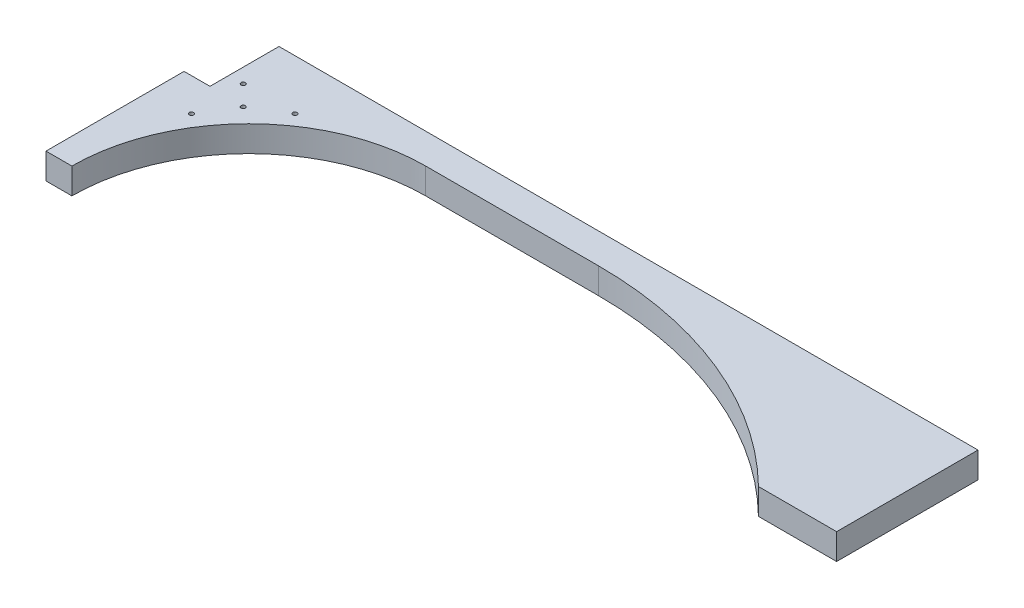
ISO-10303-21;
HEADER;
FILE_DESCRIPTION(('STEP AP214'),'2;1');
FILE_NAME('part.step','',(''),(''),'','','');
FILE_SCHEMA(('AUTOMOTIVE_DESIGN { 1 0 10303 214 1 1 1 1 }'));
ENDSEC;
DATA;
#1=APPLICATION_CONTEXT('core data for automotive mechanical design processes');
#2=APPLICATION_PROTOCOL_DEFINITION('international standard','automotive_design',2000,#1);
#3=PRODUCT_CONTEXT('',#1,'mechanical');
#4=PRODUCT('Part','Part','',(#3));
#5=PRODUCT_RELATED_PRODUCT_CATEGORY('part','',(#4));
#6=PRODUCT_DEFINITION_FORMATION('','',#4);
#7=PRODUCT_DEFINITION_CONTEXT('part definition',#1,'design');
#8=PRODUCT_DEFINITION('design','',#6,#7);
#9=PRODUCT_DEFINITION_SHAPE('','',#8);
#10=(LENGTH_UNIT() NAMED_UNIT(*) SI_UNIT(.MILLI.,.METRE.));
#11=(NAMED_UNIT(*) PLANE_ANGLE_UNIT() SI_UNIT($,.RADIAN.));
#12=(NAMED_UNIT(*) SI_UNIT($,.STERADIAN.) SOLID_ANGLE_UNIT());
#13=UNCERTAINTY_MEASURE_WITH_UNIT(LENGTH_MEASURE(1.E-05),#10,'distance_accuracy_value','');
#14=(GEOMETRIC_REPRESENTATION_CONTEXT(3) GLOBAL_UNCERTAINTY_ASSIGNED_CONTEXT((#13)) GLOBAL_UNIT_ASSIGNED_CONTEXT((#10,
#11,#12)) REPRESENTATION_CONTEXT('',''));
#15=CARTESIAN_POINT('',(0.,0.,0.));
#16=DIRECTION('',(0.,0.,1.));
#17=DIRECTION('',(1.,0.,0.));
#18=AXIS2_PLACEMENT_3D('',#15,#16,#17);
#19=CARTESIAN_POINT('',(-127.,19.05,152.4));
#20=DIRECTION('',(0.,-1.,0.));
#21=DIRECTION('',(0.,0.,-1.));
#22=AXIS2_PLACEMENT_3D('',#19,#20,#21);
#23=CYLINDRICAL_SURFACE('',#22,130.175);
#24=CARTESIAN_POINT('',(-127.,0.,152.4));
#25=DIRECTION('',(0.,1.,0.));
#26=DIRECTION('',(0.,0.,1.));
#27=AXIS2_PLACEMENT_3D('',#24,#25,#26);
#28=CIRCLE('',#27,130.175);
#29=CARTESIAN_POINT('',(-127.,0.,22.225));
#30=VERTEX_POINT('',#29);
#31=CARTESIAN_POINT('',(-257.175,0.,152.4));
#32=VERTEX_POINT('',#31);
#33=EDGE_CURVE('E143',#30,#32,#28,.T.);
#34=ORIENTED_EDGE('',*,*,#33,.F.);
#35=DIRECTION('',(0.,-1.,0.));
#36=VECTOR('',#35,1.);
#37=CARTESIAN_POINT('',(-127.,19.05,22.225));
#38=LINE('',#37,#36);
#39=CARTESIAN_POINT('',(-127.,19.05,22.225));
#40=VERTEX_POINT('',#39);
#41=EDGE_CURVE('E11',#40,#30,#38,.T.);
#42=ORIENTED_EDGE('',*,*,#41,.F.);
#43=CARTESIAN_POINT('',(-127.,19.05,152.4));
#44=DIRECTION('',(0.,1.,0.));
#45=DIRECTION('',(0.,0.,1.));
#46=AXIS2_PLACEMENT_3D('',#43,#44,#45);
#47=CIRCLE('',#46,130.175);
#48=CARTESIAN_POINT('',(-257.175,19.05,152.4));
#49=VERTEX_POINT('',#48);
#50=EDGE_CURVE('E169',#40,#49,#47,.T.);
#51=ORIENTED_EDGE('',*,*,#50,.T.);
#52=DIRECTION('',(0.,-1.,0.));
#53=VECTOR('',#52,1.);
#54=CARTESIAN_POINT('',(-257.175,19.05,152.4));
#55=LINE('',#54,#53);
#56=EDGE_CURVE('E91',#49,#32,#55,.T.);
#57=ORIENTED_EDGE('',*,*,#56,.T.);
#58=EDGE_LOOP('',(#34,#42,#51,#57));
#59=FACE_BOUND('',#58,.T.);
#60=ADVANCED_FACE('F34',(#59),#23,.F.);
#61=CARTESIAN_POINT('',(0.,19.05,22.225));
#62=DIRECTION('',(0.,0.,1.));
#63=DIRECTION('',(1.,0.,0.));
#64=AXIS2_PLACEMENT_3D('',#61,#62,#63);
#65=PLANE('',#64);
#66=DIRECTION('',(-1.,0.,0.));
#67=VECTOR('',#66,1.);
#68=CARTESIAN_POINT('',(0.,0.,22.225));
#69=LINE('',#68,#67);
#70=CARTESIAN_POINT('',(0.,0.,22.225));
#71=VERTEX_POINT('',#70);
#72=EDGE_CURVE('E146',#71,#30,#69,.T.);
#73=ORIENTED_EDGE('',*,*,#72,.F.);
#74=DIRECTION('',(0.,-1.,0.));
#75=VECTOR('',#74,1.);
#76=CARTESIAN_POINT('',(0.,19.05,22.225));
#77=LINE('',#76,#75);
#78=CARTESIAN_POINT('',(0.,19.05,22.225));
#79=VERTEX_POINT('',#78);
#80=EDGE_CURVE('E42',#79,#71,#77,.T.);
#81=ORIENTED_EDGE('',*,*,#80,.F.);
#82=DIRECTION('',(-1.,0.,0.));
#83=VECTOR('',#82,1.);
#84=CARTESIAN_POINT('',(0.,19.05,22.225));
#85=LINE('',#84,#83);
#86=EDGE_CURVE('E194',#79,#40,#85,.T.);
#87=ORIENTED_EDGE('',*,*,#86,.T.);
#88=ORIENTED_EDGE('',*,*,#41,.T.);
#89=EDGE_LOOP('',(#73,#81,#87,#88));
#90=FACE_BOUND('',#89,.T.);
#91=ADVANCED_FACE('F193',(#90),#65,.T.);
#92=CARTESIAN_POINT('',(0.,19.05,306.799531512727));
#93=DIRECTION('',(0.,-1.,0.));
#94=DIRECTION('',(0.,0.,-1.));
#95=AXIS2_PLACEMENT_3D('',#92,#93,#94);
#96=CYLINDRICAL_SURFACE('',#95,284.574531512727);
#97=CARTESIAN_POINT('',(0.,0.,306.799531512727));
#98=DIRECTION('',(0.,1.,0.));
#99=DIRECTION('',(0.,0.,1.));
#100=AXIS2_PLACEMENT_3D('',#97,#98,#99);
#101=CIRCLE('',#100,284.574531512727);
#102=CARTESIAN_POINT('',(199.670208732562,0.,104.032493436064));
#103=VERTEX_POINT('',#102);
#104=EDGE_CURVE('E150',#71,#103,#101,.F.);
#105=ORIENTED_EDGE('',*,*,#104,.T.);
#106=DIRECTION('',(0.,-1.,0.));
#107=VECTOR('',#106,1.);
#108=CARTESIAN_POINT('',(199.670208732562,19.05,104.032493436064));
#109=LINE('',#108,#107);
#110=CARTESIAN_POINT('',(199.670208732562,19.05,104.032493436064));
#111=VERTEX_POINT('',#110);
#112=EDGE_CURVE('E179',#111,#103,#109,.T.);
#113=ORIENTED_EDGE('',*,*,#112,.F.);
#114=CARTESIAN_POINT('',(0.,19.05,306.799531512727));
#115=DIRECTION('',(0.,1.,0.));
#116=DIRECTION('',(0.,0.,1.));
#117=AXIS2_PLACEMENT_3D('',#114,#115,#116);
#118=CIRCLE('',#117,284.574531512727);
#119=EDGE_CURVE('E185',#79,#111,#118,.F.);
#120=ORIENTED_EDGE('',*,*,#119,.F.);
#121=ORIENTED_EDGE('',*,*,#80,.T.);
#122=EDGE_LOOP('',(#105,#113,#120,#121));
#123=FACE_BOUND('',#122,.T.);
#124=ADVANCED_FACE('F183',(#123),#96,.F.);
#125=CARTESIAN_POINT('',(0.,19.05,104.032493436064));
#126=DIRECTION('',(0.,0.,1.));
#127=DIRECTION('',(1.,0.,0.));
#128=AXIS2_PLACEMENT_3D('',#125,#126,#127);
#129=PLANE('',#128);
#130=DIRECTION('',(-1.,0.,0.));
#131=VECTOR('',#130,1.);
#132=CARTESIAN_POINT('',(0.,0.,104.032493436064));
#133=LINE('',#132,#131);
#134=CARTESIAN_POINT('',(257.175,0.,104.032493436064));
#135=VERTEX_POINT('',#134);
#136=EDGE_CURVE('E153',#135,#103,#133,.T.);
#137=ORIENTED_EDGE('',*,*,#136,.F.);
#138=DIRECTION('',(0.,-1.,0.));
#139=VECTOR('',#138,1.);
#140=CARTESIAN_POINT('',(257.175,19.05,104.032493436064));
#141=LINE('',#140,#139);
#142=CARTESIAN_POINT('',(257.175,19.05,104.032493436064));
#143=VERTEX_POINT('',#142);
#144=EDGE_CURVE('E177',#143,#135,#141,.T.);
#145=ORIENTED_EDGE('',*,*,#144,.F.);
#146=DIRECTION('',(-1.,0.,0.));
#147=VECTOR('',#146,1.);
#148=CARTESIAN_POINT('',(0.,19.05,104.032493436064));
#149=LINE('',#148,#147);
#150=EDGE_CURVE('E204',#143,#111,#149,.T.);
#151=ORIENTED_EDGE('',*,*,#150,.T.);
#152=ORIENTED_EDGE('',*,*,#112,.T.);
#153=EDGE_LOOP('',(#137,#145,#151,#152));
#154=FACE_BOUND('',#153,.T.);
#155=ADVANCED_FACE('F222',(#154),#129,.T.);
#156=CARTESIAN_POINT('',(257.175,19.05,0.));
#157=DIRECTION('',(1.,0.,0.));
#158=DIRECTION('',(0.,0.,-1.));
#159=AXIS2_PLACEMENT_3D('',#156,#157,#158);
#160=PLANE('',#159);
#161=DIRECTION('',(0.,0.,1.));
#162=VECTOR('',#161,1.);
#163=CARTESIAN_POINT('',(257.175,0.,0.));
#164=LINE('',#163,#162);
#165=CARTESIAN_POINT('',(257.175,0.,0.));
#166=VERTEX_POINT('',#165);
#167=EDGE_CURVE('E156',#166,#135,#164,.T.);
#168=ORIENTED_EDGE('',*,*,#167,.F.);
#169=DIRECTION('',(0.,-1.,0.));
#170=VECTOR('',#169,1.);
#171=CARTESIAN_POINT('',(257.175,19.05,0.));
#172=LINE('',#171,#170);
#173=CARTESIAN_POINT('',(257.175,19.05,0.));
#174=VERTEX_POINT('',#173);
#175=EDGE_CURVE('E175',#174,#166,#172,.T.);
#176=ORIENTED_EDGE('',*,*,#175,.F.);
#177=DIRECTION('',(0.,0.,1.));
#178=VECTOR('',#177,1.);
#179=CARTESIAN_POINT('',(257.175,19.05,0.));
#180=LINE('',#179,#178);
#181=EDGE_CURVE('E207',#174,#143,#180,.T.);
#182=ORIENTED_EDGE('',*,*,#181,.T.);
#183=ORIENTED_EDGE('',*,*,#144,.T.);
#184=EDGE_LOOP('',(#168,#176,#182,#183));
#185=FACE_BOUND('',#184,.T.);
#186=ADVANCED_FACE('F220',(#185),#160,.T.);
#187=CARTESIAN_POINT('',(0.,19.05,0.));
#188=DIRECTION('',(0.,0.,-1.));
#189=DIRECTION('',(-1.,0.,0.));
#190=AXIS2_PLACEMENT_3D('',#187,#188,#189);
#191=PLANE('',#190);
#192=DIRECTION('',(1.,0.,0.));
#193=VECTOR('',#192,1.);
#194=CARTESIAN_POINT('',(0.,0.,0.));
#195=LINE('',#194,#193);
#196=CARTESIAN_POINT('',(-257.175,0.,0.));
#197=VERTEX_POINT('',#196);
#198=EDGE_CURVE('E159',#197,#166,#195,.T.);
#199=ORIENTED_EDGE('',*,*,#198,.F.);
#200=DIRECTION('',(0.,-1.,0.));
#201=VECTOR('',#200,1.);
#202=CARTESIAN_POINT('',(-257.175,19.05,0.));
#203=LINE('',#202,#201);
#204=CARTESIAN_POINT('',(-257.175,19.05,0.));
#205=VERTEX_POINT('',#204);
#206=EDGE_CURVE('E173',#205,#197,#203,.T.);
#207=ORIENTED_EDGE('',*,*,#206,.F.);
#208=DIRECTION('',(1.,0.,0.));
#209=VECTOR('',#208,1.);
#210=CARTESIAN_POINT('',(0.,19.05,0.));
#211=LINE('',#210,#209);
#212=EDGE_CURVE('E138',#205,#174,#211,.T.);
#213=ORIENTED_EDGE('',*,*,#212,.T.);
#214=ORIENTED_EDGE('',*,*,#175,.T.);
#215=EDGE_LOOP('',(#199,#207,#213,#214));
#216=FACE_BOUND('',#215,.T.);
#217=ADVANCED_FACE('F212',(#216),#191,.T.);
#218=CARTESIAN_POINT('',(-257.175,19.05,0.));
#219=DIRECTION('',(-1.,0.,0.));
#220=DIRECTION('',(0.,0.,1.));
#221=AXIS2_PLACEMENT_3D('',#218,#219,#220);
#222=PLANE('',#221);
#223=DIRECTION('',(0.,0.,-1.));
#224=VECTOR('',#223,1.);
#225=CARTESIAN_POINT('',(-257.175,0.,0.));
#226=LINE('',#225,#224);
#227=CARTESIAN_POINT('',(-257.175,0.,50.8));
#228=VERTEX_POINT('',#227);
#229=EDGE_CURVE('E162',#228,#197,#226,.T.);
#230=ORIENTED_EDGE('',*,*,#229,.F.);
#231=DIRECTION('',(0.,-1.,0.));
#232=VECTOR('',#231,1.);
#233=CARTESIAN_POINT('',(-257.175,19.05,50.8));
#234=LINE('',#233,#232);
#235=CARTESIAN_POINT('',(-257.175,19.05,50.8));
#236=VERTEX_POINT('',#235);
#237=EDGE_CURVE('E126',#236,#228,#234,.T.);
#238=ORIENTED_EDGE('',*,*,#237,.F.);
#239=DIRECTION('',(0.,0.,-1.));
#240=VECTOR('',#239,1.);
#241=CARTESIAN_POINT('',(-257.175,19.05,0.));
#242=LINE('',#241,#240);
#243=EDGE_CURVE('E136',#236,#205,#242,.T.);
#244=ORIENTED_EDGE('',*,*,#243,.T.);
#245=ORIENTED_EDGE('',*,*,#206,.T.);
#246=EDGE_LOOP('',(#230,#238,#244,#245));
#247=FACE_BOUND('',#246,.T.);
#248=ADVANCED_FACE('F218',(#247),#222,.T.);
#249=CARTESIAN_POINT('',(0.,19.05,50.8));
#250=DIRECTION('',(0.,0.,-1.));
#251=DIRECTION('',(-1.,0.,0.));
#252=AXIS2_PLACEMENT_3D('',#249,#250,#251);
#253=PLANE('',#252);
#254=DIRECTION('',(1.,0.,0.));
#255=VECTOR('',#254,1.);
#256=CARTESIAN_POINT('',(0.,0.,50.8));
#257=LINE('',#256,#255);
#258=CARTESIAN_POINT('',(-276.225,0.,50.8));
#259=VERTEX_POINT('',#258);
#260=EDGE_CURVE('E125',#259,#228,#257,.T.);
#261=ORIENTED_EDGE('',*,*,#260,.F.);
#262=DIRECTION('',(0.,-1.,0.));
#263=VECTOR('',#262,1.);
#264=CARTESIAN_POINT('',(-276.225,19.05,50.8));
#265=LINE('',#264,#263);
#266=CARTESIAN_POINT('',(-276.225,19.05,50.8));
#267=VERTEX_POINT('',#266);
#268=EDGE_CURVE('E119',#267,#259,#265,.T.);
#269=ORIENTED_EDGE('',*,*,#268,.F.);
#270=DIRECTION('',(1.,0.,0.));
#271=VECTOR('',#270,1.);
#272=CARTESIAN_POINT('',(0.,19.05,50.8));
#273=LINE('',#272,#271);
#274=EDGE_CURVE('E123',#267,#236,#273,.T.);
#275=ORIENTED_EDGE('',*,*,#274,.T.);
#276=ORIENTED_EDGE('',*,*,#237,.T.);
#277=EDGE_LOOP('',(#261,#269,#275,#276));
#278=FACE_BOUND('',#277,.T.);
#279=ADVANCED_FACE('F121',(#278),#253,.T.);
#280=CARTESIAN_POINT('',(-276.225,19.05,0.));
#281=DIRECTION('',(1.,0.,0.));
#282=DIRECTION('',(0.,0.,-1.));
#283=AXIS2_PLACEMENT_3D('',#280,#281,#282);
#284=PLANE('',#283);
#285=DIRECTION('',(0.,0.,1.));
#286=VECTOR('',#285,1.);
#287=CARTESIAN_POINT('',(-276.225,0.,0.));
#288=LINE('',#287,#286);
#289=CARTESIAN_POINT('',(-276.225,0.,152.4));
#290=VERTEX_POINT('',#289);
#291=EDGE_CURVE('E84',#259,#290,#288,.T.);
#292=ORIENTED_EDGE('',*,*,#291,.T.);
#293=DIRECTION('',(0.,-1.,0.));
#294=VECTOR('',#293,1.);
#295=CARTESIAN_POINT('',(-276.225,19.05,152.4));
#296=LINE('',#295,#294);
#297=CARTESIAN_POINT('',(-276.225,19.05,152.4));
#298=VERTEX_POINT('',#297);
#299=EDGE_CURVE('E127',#298,#290,#296,.T.);
#300=ORIENTED_EDGE('',*,*,#299,.F.);
#301=DIRECTION('',(0.,0.,1.));
#302=VECTOR('',#301,1.);
#303=CARTESIAN_POINT('',(-276.225,19.05,0.));
#304=LINE('',#303,#302);
#305=EDGE_CURVE('E129',#267,#298,#304,.T.);
#306=ORIENTED_EDGE('',*,*,#305,.F.);
#307=ORIENTED_EDGE('',*,*,#268,.T.);
#308=EDGE_LOOP('',(#292,#300,#306,#307));
#309=FACE_BOUND('',#308,.T.);
#310=ADVANCED_FACE('F130',(#309),#284,.F.);
#311=CARTESIAN_POINT('',(-2.22044604925031E-13,19.05,152.4));
#312=DIRECTION('',(0.,0.,-1.));
#313=DIRECTION('',(-1.,0.,0.));
#314=AXIS2_PLACEMENT_3D('',#311,#312,#313);
#315=PLANE('',#314);
#316=DIRECTION('',(1.,0.,0.));
#317=VECTOR('',#316,1.);
#318=CARTESIAN_POINT('',(-2.22044604925031E-13,0.,152.4));
#319=LINE('',#318,#317);
#320=EDGE_CURVE('E167',#290,#32,#319,.T.);
#321=ORIENTED_EDGE('',*,*,#320,.T.);
#322=ORIENTED_EDGE('',*,*,#56,.F.);
#323=DIRECTION('',(1.,0.,0.));
#324=VECTOR('',#323,1.);
#325=CARTESIAN_POINT('',(-2.22044604925031E-13,19.05,152.4));
#326=LINE('',#325,#324);
#327=EDGE_CURVE('E50',#298,#49,#326,.T.);
#328=ORIENTED_EDGE('',*,*,#327,.F.);
#329=ORIENTED_EDGE('',*,*,#299,.T.);
#330=EDGE_LOOP('',(#321,#322,#328,#329));
#331=FACE_BOUND('',#330,.T.);
#332=ADVANCED_FACE('F197',(#331),#315,.F.);
#333=CARTESIAN_POINT('',(0.,19.05,0.));
#334=DIRECTION('',(0.,1.,0.));
#335=DIRECTION('',(0.,0.,1.));
#336=AXIS2_PLACEMENT_3D('',#333,#334,#335);
#337=PLANE('',#336);
#338=CARTESIAN_POINT('',(-246.55254444818,19.05,36.961239505133));
#339=DIRECTION('',(0.,1.,0.));
#340=DIRECTION('',(0.,0.,1.));
#341=AXIS2_PLACEMENT_3D('',#338,#339,#340);
#342=CIRCLE('',#341,1.58749999999999);
#343=CARTESIAN_POINT('',(-246.55254444818,19.05,38.548739505133));
#344=VERTEX_POINT('',#343);
#345=EDGE_CURVE('E455',#344,#344,#342,.T.);
#346=ORIENTED_EDGE('',*,*,#345,.F.);
#347=EDGE_LOOP('',(#346));
#348=FACE_BOUND('',#347,.T.);
#349=CARTESIAN_POINT('',(-208.45254444818,19.05,36.961239505133));
#350=DIRECTION('',(0.,1.,0.));
#351=DIRECTION('',(0.,0.,1.));
#352=AXIS2_PLACEMENT_3D('',#349,#350,#351);
#353=CIRCLE('',#352,1.58749999999999);
#354=CARTESIAN_POINT('',(-208.45254444818,19.05,38.548739505133));
#355=VERTEX_POINT('',#354);
#356=EDGE_CURVE('E457',#355,#355,#353,.T.);
#357=ORIENTED_EDGE('',*,*,#356,.F.);
#358=EDGE_LOOP('',(#357));
#359=FACE_BOUND('',#358,.T.);
#360=CARTESIAN_POINT('',(-246.55254444818,19.05,75.0612395051329));
#361=DIRECTION('',(0.,1.,0.));
#362=DIRECTION('',(0.,0.,1.));
#363=AXIS2_PLACEMENT_3D('',#360,#361,#362);
#364=CIRCLE('',#363,1.58749999999999);
#365=CARTESIAN_POINT('',(-246.55254444818,19.05,76.6487395051329));
#366=VERTEX_POINT('',#365);
#367=EDGE_CURVE('E465',#366,#366,#364,.T.);
#368=ORIENTED_EDGE('',*,*,#367,.F.);
#369=EDGE_LOOP('',(#368));
#370=FACE_BOUND('',#369,.T.);
#371=CARTESIAN_POINT('',(-231.830017346067,19.05,51.6837666072456));
#372=DIRECTION('',(0.,1.,0.));
#373=DIRECTION('',(0.,0.,1.));
#374=AXIS2_PLACEMENT_3D('',#371,#372,#373);
#375=CIRCLE('',#374,1.58749999999999);
#376=CARTESIAN_POINT('',(-231.830017346067,19.05,53.2712666072456));
#377=VERTEX_POINT('',#376);
#378=EDGE_CURVE('E471',#377,#377,#375,.T.);
#379=ORIENTED_EDGE('',*,*,#378,.F.);
#380=EDGE_LOOP('',(#379));
#381=FACE_BOUND('',#380,.T.);
#382=ORIENTED_EDGE('',*,*,#50,.F.);
#383=ORIENTED_EDGE('',*,*,#86,.F.);
#384=ORIENTED_EDGE('',*,*,#119,.T.);
#385=ORIENTED_EDGE('',*,*,#150,.F.);
#386=ORIENTED_EDGE('',*,*,#181,.F.);
#387=ORIENTED_EDGE('',*,*,#212,.F.);
#388=ORIENTED_EDGE('',*,*,#243,.F.);
#389=ORIENTED_EDGE('',*,*,#274,.F.);
#390=ORIENTED_EDGE('',*,*,#305,.T.);
#391=ORIENTED_EDGE('',*,*,#327,.T.);
#392=EDGE_LOOP('',(#382,#383,#384,#385,#386,#387,#388,#389,#390,#391));
#393=FACE_BOUND('',#392,.T.);
#394=ADVANCED_FACE('F133',(#348,#359,#370,#381,#393),#337,.T.);
#395=CARTESIAN_POINT('',(0.,0.,0.));
#396=DIRECTION('',(0.,1.,0.));
#397=DIRECTION('',(0.,0.,1.));
#398=AXIS2_PLACEMENT_3D('',#395,#396,#397);
#399=PLANE('',#398);
#400=CARTESIAN_POINT('',(-246.55254444818,0.,36.961239505133));
#401=DIRECTION('',(0.,1.,0.));
#402=DIRECTION('',(0.,0.,1.));
#403=AXIS2_PLACEMENT_3D('',#400,#401,#402);
#404=CIRCLE('',#403,1.58749999999999);
#405=CARTESIAN_POINT('',(-246.55254444818,0.,38.548739505133));
#406=VERTEX_POINT('',#405);
#407=EDGE_CURVE('E452',#406,#406,#404,.T.);
#408=ORIENTED_EDGE('',*,*,#407,.T.);
#409=EDGE_LOOP('',(#408));
#410=FACE_BOUND('',#409,.T.);
#411=CARTESIAN_POINT('',(-208.45254444818,0.,36.961239505133));
#412=DIRECTION('',(0.,1.,0.));
#413=DIRECTION('',(0.,0.,1.));
#414=AXIS2_PLACEMENT_3D('',#411,#412,#413);
#415=CIRCLE('',#414,1.58749999999999);
#416=CARTESIAN_POINT('',(-208.45254444818,0.,38.548739505133));
#417=VERTEX_POINT('',#416);
#418=EDGE_CURVE('E462',#417,#417,#415,.T.);
#419=ORIENTED_EDGE('',*,*,#418,.T.);
#420=EDGE_LOOP('',(#419));
#421=FACE_BOUND('',#420,.T.);
#422=CARTESIAN_POINT('',(-246.55254444818,0.,75.0612395051329));
#423=DIRECTION('',(0.,1.,0.));
#424=DIRECTION('',(0.,0.,1.));
#425=AXIS2_PLACEMENT_3D('',#422,#423,#424);
#426=CIRCLE('',#425,1.58749999999999);
#427=CARTESIAN_POINT('',(-246.55254444818,0.,76.6487395051329));
#428=VERTEX_POINT('',#427);
#429=EDGE_CURVE('E468',#428,#428,#426,.T.);
#430=ORIENTED_EDGE('',*,*,#429,.T.);
#431=EDGE_LOOP('',(#430));
#432=FACE_BOUND('',#431,.T.);
#433=CARTESIAN_POINT('',(-231.830017346067,0.,51.6837666072456));
#434=DIRECTION('',(0.,1.,0.));
#435=DIRECTION('',(0.,0.,1.));
#436=AXIS2_PLACEMENT_3D('',#433,#434,#435);
#437=CIRCLE('',#436,1.58749999999999);
#438=CARTESIAN_POINT('',(-231.830017346067,0.,53.2712666072456));
#439=VERTEX_POINT('',#438);
#440=EDGE_CURVE('E474',#439,#439,#437,.T.);
#441=ORIENTED_EDGE('',*,*,#440,.T.);
#442=EDGE_LOOP('',(#441));
#443=FACE_BOUND('',#442,.T.);
#444=CARTESIAN_POINT('',(0.,0.,11.1125));
#445=DIRECTION('',(0.,-1.,0.));
#446=DIRECTION('',(0.,0.,-1.));
#447=AXIS2_PLACEMENT_3D('',#444,#445,#446);
#448=CIRCLE('',#447,1.58749999999999);
#449=CARTESIAN_POINT('',(0.,0.,9.52500000000003));
#450=VERTEX_POINT('',#449);
#451=EDGE_CURVE('E477',#450,#450,#448,.T.);
#452=ORIENTED_EDGE('',*,*,#451,.F.);
#453=EDGE_LOOP('',(#452));
#454=FACE_BOUND('',#453,.T.);
#455=CARTESIAN_POINT('',(-225.425,0.,23.8125));
#456=DIRECTION('',(0.,-1.,0.));
#457=DIRECTION('',(0.,0.,-1.));
#458=AXIS2_PLACEMENT_3D('',#455,#456,#457);
#459=CIRCLE('',#458,1.58749999999999);
#460=CARTESIAN_POINT('',(-225.425,0.,22.225));
#461=VERTEX_POINT('',#460);
#462=EDGE_CURVE('E483',#461,#461,#459,.T.);
#463=ORIENTED_EDGE('',*,*,#462,.F.);
#464=EDGE_LOOP('',(#463));
#465=FACE_BOUND('',#464,.T.);
#466=CARTESIAN_POINT('',(225.425,0.,23.8125));
#467=DIRECTION('',(0.,-1.,0.));
#468=DIRECTION('',(0.,0.,-1.));
#469=AXIS2_PLACEMENT_3D('',#466,#467,#468);
#470=CIRCLE('',#469,1.58749999999999);
#471=CARTESIAN_POINT('',(225.425,0.,22.2250000000001));
#472=VERTEX_POINT('',#471);
#473=EDGE_CURVE('E489',#472,#472,#470,.T.);
#474=ORIENTED_EDGE('',*,*,#473,.F.);
#475=EDGE_LOOP('',(#474));
#476=FACE_BOUND('',#475,.T.);
#477=CARTESIAN_POINT('',(225.425,0.,67.5199934360639));
#478=DIRECTION('',(0.,-1.,0.));
#479=DIRECTION('',(0.,0.,-1.));
#480=AXIS2_PLACEMENT_3D('',#477,#478,#479);
#481=CIRCLE('',#480,1.58749999999999);
#482=CARTESIAN_POINT('',(225.425,0.,65.9324934360639));
#483=VERTEX_POINT('',#482);
#484=EDGE_CURVE('E495',#483,#483,#481,.T.);
#485=ORIENTED_EDGE('',*,*,#484,.F.);
#486=EDGE_LOOP('',(#485));
#487=FACE_BOUND('',#486,.T.);
#488=CARTESIAN_POINT('',(-257.175,0.,84.6005530996012));
#489=DIRECTION('',(0.,-1.,0.));
#490=DIRECTION('',(0.,0.,-1.));
#491=AXIS2_PLACEMENT_3D('',#488,#489,#490);
#492=CIRCLE('',#491,1.58749999999996);
#493=CARTESIAN_POINT('',(-257.175,0.,83.0130530996013));
#494=VERTEX_POINT('',#493);
#495=EDGE_CURVE('E500',#494,#494,#492,.T.);
#496=ORIENTED_EDGE('',*,*,#495,.F.);
#497=EDGE_LOOP('',(#496));
#498=FACE_BOUND('',#497,.T.);
#499=ORIENTED_EDGE('',*,*,#33,.T.);
#500=ORIENTED_EDGE('',*,*,#320,.F.);
#501=ORIENTED_EDGE('',*,*,#291,.F.);
#502=ORIENTED_EDGE('',*,*,#260,.T.);
#503=ORIENTED_EDGE('',*,*,#229,.T.);
#504=ORIENTED_EDGE('',*,*,#198,.T.);
#505=ORIENTED_EDGE('',*,*,#167,.T.);
#506=ORIENTED_EDGE('',*,*,#136,.T.);
#507=ORIENTED_EDGE('',*,*,#104,.F.);
#508=ORIENTED_EDGE('',*,*,#72,.T.);
#509=EDGE_LOOP('',(#499,#500,#501,#502,#503,#504,#505,#506,#507,#508));
#510=FACE_BOUND('',#509,.T.);
#511=ADVANCED_FACE('F191',(#410,#421,#432,#443,#454,#465,#476,#487,#498,#510),#399,.F.);
#512=CARTESIAN_POINT('',(-257.175,11.1252,84.6005530996012));
#513=DIRECTION('',(0.,-1.,0.));
#514=DIRECTION('',(0.,0.,-1.));
#515=AXIS2_PLACEMENT_3D('',#512,#513,#514);
#516=CONICAL_SURFACE('',#515,1.58749999999996,1.02974425867664);
#517=CARTESIAN_POINT('',(-257.175,12.0790662327063,84.6005530996012));
#518=VERTEX_POINT('',#517);
#519=VERTEX_LOOP('',#518);
#520=FACE_BOUND('',#519,.T.);
#521=CARTESIAN_POINT('',(-257.175,11.1252,84.6005530996012));
#522=DIRECTION('',(0.,-1.,0.));
#523=DIRECTION('',(0.,0.,-1.));
#524=AXIS2_PLACEMENT_3D('',#521,#522,#523);
#525=CIRCLE('',#524,1.58749999999996);
#526=CARTESIAN_POINT('',(-257.175,11.1252,83.0130530996013));
#527=VERTEX_POINT('',#526);
#528=EDGE_CURVE('E147',#527,#527,#525,.T.);
#529=ORIENTED_EDGE('',*,*,#528,.T.);
#530=EDGE_LOOP('',(#529));
#531=FACE_BOUND('',#530,.T.);
#532=ADVANCED_FACE('F298',(#520,#531),#516,.F.);
#533=CARTESIAN_POINT('',(-257.175,0.,84.6005530996012));
#534=DIRECTION('',(0.,-1.,0.));
#535=DIRECTION('',(0.,0.,-1.));
#536=AXIS2_PLACEMENT_3D('',#533,#534,#535);
#537=CYLINDRICAL_SURFACE('',#536,1.58749999999996);
#538=ORIENTED_EDGE('',*,*,#528,.F.);
#539=EDGE_LOOP('',(#538));
#540=FACE_BOUND('',#539,.T.);
#541=ORIENTED_EDGE('',*,*,#495,.T.);
#542=EDGE_LOOP('',(#541));
#543=FACE_BOUND('',#542,.T.);
#544=ADVANCED_FACE('F303',(#540,#543),#537,.F.);
#545=CARTESIAN_POINT('',(225.425,11.1252,67.5199934360639));
#546=DIRECTION('',(0.,-1.,0.));
#547=DIRECTION('',(0.,0.,-1.));
#548=AXIS2_PLACEMENT_3D('',#545,#546,#547);
#549=CONICAL_SURFACE('',#548,1.58749999999999,1.02974425867665);
#550=CARTESIAN_POINT('',(225.425,12.0790662327063,67.5199934360639));
#551=VERTEX_POINT('',#550);
#552=VERTEX_LOOP('',#551);
#553=FACE_BOUND('',#552,.T.);
#554=CARTESIAN_POINT('',(225.425,11.1252,67.5199934360639));
#555=DIRECTION('',(0.,-1.,0.));
#556=DIRECTION('',(0.,0.,-1.));
#557=AXIS2_PLACEMENT_3D('',#554,#555,#556);
#558=CIRCLE('',#557,1.58749999999999);
#559=CARTESIAN_POINT('',(225.425,11.1252,65.9324934360639));
#560=VERTEX_POINT('',#559);
#561=EDGE_CURVE('E498',#560,#560,#558,.T.);
#562=ORIENTED_EDGE('',*,*,#561,.T.);
#563=EDGE_LOOP('',(#562));
#564=FACE_BOUND('',#563,.T.);
#565=ADVANCED_FACE('F315',(#553,#564),#549,.F.);
#566=CARTESIAN_POINT('',(225.425,0.,67.5199934360639));
#567=DIRECTION('',(0.,-1.,0.));
#568=DIRECTION('',(0.,0.,-1.));
#569=AXIS2_PLACEMENT_3D('',#566,#567,#568);
#570=CYLINDRICAL_SURFACE('',#569,1.58749999999999);
#571=ORIENTED_EDGE('',*,*,#561,.F.);
#572=EDGE_LOOP('',(#571));
#573=FACE_BOUND('',#572,.T.);
#574=ORIENTED_EDGE('',*,*,#484,.T.);
#575=EDGE_LOOP('',(#574));
#576=FACE_BOUND('',#575,.T.);
#577=ADVANCED_FACE('F325',(#573,#576),#570,.F.);
#578=CARTESIAN_POINT('',(225.425,11.1252,23.8125));
#579=DIRECTION('',(0.,-1.,0.));
#580=DIRECTION('',(0.,0.,-1.));
#581=AXIS2_PLACEMENT_3D('',#578,#579,#580);
#582=CONICAL_SURFACE('',#581,1.58749999999999,1.02974425867665);
#583=CARTESIAN_POINT('',(225.425,12.0790662327063,23.8125));
#584=VERTEX_POINT('',#583);
#585=VERTEX_LOOP('',#584);
#586=FACE_BOUND('',#585,.T.);
#587=CARTESIAN_POINT('',(225.425,11.1252,23.8125));
#588=DIRECTION('',(0.,-1.,0.));
#589=DIRECTION('',(0.,0.,-1.));
#590=AXIS2_PLACEMENT_3D('',#587,#588,#589);
#591=CIRCLE('',#590,1.58749999999999);
#592=CARTESIAN_POINT('',(225.425,11.1252,22.2250000000001));
#593=VERTEX_POINT('',#592);
#594=EDGE_CURVE('E492',#593,#593,#591,.T.);
#595=ORIENTED_EDGE('',*,*,#594,.T.);
#596=EDGE_LOOP('',(#595));
#597=FACE_BOUND('',#596,.T.);
#598=ADVANCED_FACE('F335',(#586,#597),#582,.F.);
#599=CARTESIAN_POINT('',(225.425,0.,23.8125));
#600=DIRECTION('',(0.,-1.,0.));
#601=DIRECTION('',(0.,0.,-1.));
#602=AXIS2_PLACEMENT_3D('',#599,#600,#601);
#603=CYLINDRICAL_SURFACE('',#602,1.58749999999999);
#604=ORIENTED_EDGE('',*,*,#594,.F.);
#605=EDGE_LOOP('',(#604));
#606=FACE_BOUND('',#605,.T.);
#607=ORIENTED_EDGE('',*,*,#473,.T.);
#608=EDGE_LOOP('',(#607));
#609=FACE_BOUND('',#608,.T.);
#610=ADVANCED_FACE('F345',(#606,#609),#603,.F.);
#611=CARTESIAN_POINT('',(-225.425,11.1252,23.8125));
#612=DIRECTION('',(0.,-1.,0.));
#613=DIRECTION('',(0.,0.,-1.));
#614=AXIS2_PLACEMENT_3D('',#611,#612,#613);
#615=CONICAL_SURFACE('',#614,1.58749999999999,1.02974425867665);
#616=CARTESIAN_POINT('',(-225.425,12.0790662327063,23.8125));
#617=VERTEX_POINT('',#616);
#618=VERTEX_LOOP('',#617);
#619=FACE_BOUND('',#618,.T.);
#620=CARTESIAN_POINT('',(-225.425,11.1252,23.8125));
#621=DIRECTION('',(0.,-1.,0.));
#622=DIRECTION('',(0.,0.,-1.));
#623=AXIS2_PLACEMENT_3D('',#620,#621,#622);
#624=CIRCLE('',#623,1.58749999999999);
#625=CARTESIAN_POINT('',(-225.425,11.1252,22.225));
#626=VERTEX_POINT('',#625);
#627=EDGE_CURVE('E486',#626,#626,#624,.T.);
#628=ORIENTED_EDGE('',*,*,#627,.T.);
#629=EDGE_LOOP('',(#628));
#630=FACE_BOUND('',#629,.T.);
#631=ADVANCED_FACE('F355',(#619,#630),#615,.F.);
#632=CARTESIAN_POINT('',(-225.425,0.,23.8125));
#633=DIRECTION('',(0.,-1.,0.));
#634=DIRECTION('',(0.,0.,-1.));
#635=AXIS2_PLACEMENT_3D('',#632,#633,#634);
#636=CYLINDRICAL_SURFACE('',#635,1.58749999999999);
#637=ORIENTED_EDGE('',*,*,#627,.F.);
#638=EDGE_LOOP('',(#637));
#639=FACE_BOUND('',#638,.T.);
#640=ORIENTED_EDGE('',*,*,#462,.T.);
#641=EDGE_LOOP('',(#640));
#642=FACE_BOUND('',#641,.T.);
#643=ADVANCED_FACE('F365',(#639,#642),#636,.F.);
#644=CARTESIAN_POINT('',(0.,11.1252,11.1125));
#645=DIRECTION('',(0.,-1.,0.));
#646=DIRECTION('',(0.,0.,-1.));
#647=AXIS2_PLACEMENT_3D('',#644,#645,#646);
#648=CONICAL_SURFACE('',#647,1.58749999999999,1.02974425867665);
#649=CARTESIAN_POINT('',(0.,12.0790662327063,11.1125));
#650=VERTEX_POINT('',#649);
#651=VERTEX_LOOP('',#650);
#652=FACE_BOUND('',#651,.T.);
#653=CARTESIAN_POINT('',(0.,11.1252,11.1125));
#654=DIRECTION('',(0.,-1.,0.));
#655=DIRECTION('',(0.,0.,-1.));
#656=AXIS2_PLACEMENT_3D('',#653,#654,#655);
#657=CIRCLE('',#656,1.58749999999999);
#658=CARTESIAN_POINT('',(0.,11.1252,9.52500000000003));
#659=VERTEX_POINT('',#658);
#660=EDGE_CURVE('E480',#659,#659,#657,.T.);
#661=ORIENTED_EDGE('',*,*,#660,.T.);
#662=EDGE_LOOP('',(#661));
#663=FACE_BOUND('',#662,.T.);
#664=ADVANCED_FACE('F375',(#652,#663),#648,.F.);
#665=CARTESIAN_POINT('',(0.,0.,11.1125));
#666=DIRECTION('',(0.,-1.,0.));
#667=DIRECTION('',(0.,0.,-1.));
#668=AXIS2_PLACEMENT_3D('',#665,#666,#667);
#669=CYLINDRICAL_SURFACE('',#668,1.58749999999999);
#670=ORIENTED_EDGE('',*,*,#660,.F.);
#671=EDGE_LOOP('',(#670));
#672=FACE_BOUND('',#671,.T.);
#673=ORIENTED_EDGE('',*,*,#451,.T.);
#674=EDGE_LOOP('',(#673));
#675=FACE_BOUND('',#674,.T.);
#676=ADVANCED_FACE('F385',(#672,#675),#669,.F.);
#677=CARTESIAN_POINT('',(-231.830017346067,19.05,51.6837666072456));
#678=DIRECTION('',(0.,1.,0.));
#679=DIRECTION('',(0.,0.,1.));
#680=AXIS2_PLACEMENT_3D('',#677,#678,#679);
#681=CYLINDRICAL_SURFACE('',#680,1.58749999999999);
#682=ORIENTED_EDGE('',*,*,#440,.F.);
#683=EDGE_LOOP('',(#682));
#684=FACE_BOUND('',#683,.T.);
#685=ORIENTED_EDGE('',*,*,#378,.T.);
#686=EDGE_LOOP('',(#685));
#687=FACE_BOUND('',#686,.T.);
#688=ADVANCED_FACE('F395',(#684,#687),#681,.F.);
#689=CARTESIAN_POINT('',(-246.55254444818,19.05,75.0612395051329));
#690=DIRECTION('',(0.,1.,0.));
#691=DIRECTION('',(0.,0.,1.));
#692=AXIS2_PLACEMENT_3D('',#689,#690,#691);
#693=CYLINDRICAL_SURFACE('',#692,1.58749999999999);
#694=ORIENTED_EDGE('',*,*,#429,.F.);
#695=EDGE_LOOP('',(#694));
#696=FACE_BOUND('',#695,.T.);
#697=ORIENTED_EDGE('',*,*,#367,.T.);
#698=EDGE_LOOP('',(#697));
#699=FACE_BOUND('',#698,.T.);
#700=ADVANCED_FACE('F415',(#696,#699),#693,.F.);
#701=CARTESIAN_POINT('',(-208.45254444818,19.05,36.961239505133));
#702=DIRECTION('',(0.,1.,0.));
#703=DIRECTION('',(0.,0.,1.));
#704=AXIS2_PLACEMENT_3D('',#701,#702,#703);
#705=CYLINDRICAL_SURFACE('',#704,1.58749999999999);
#706=ORIENTED_EDGE('',*,*,#418,.F.);
#707=EDGE_LOOP('',(#706));
#708=FACE_BOUND('',#707,.T.);
#709=ORIENTED_EDGE('',*,*,#356,.T.);
#710=EDGE_LOOP('',(#709));
#711=FACE_BOUND('',#710,.T.);
#712=ADVANCED_FACE('F425',(#708,#711),#705,.F.);
#713=CARTESIAN_POINT('',(-246.55254444818,19.05,36.961239505133));
#714=DIRECTION('',(0.,1.,0.));
#715=DIRECTION('',(0.,0.,1.));
#716=AXIS2_PLACEMENT_3D('',#713,#714,#715);
#717=CYLINDRICAL_SURFACE('',#716,1.58749999999999);
#718=ORIENTED_EDGE('',*,*,#407,.F.);
#719=EDGE_LOOP('',(#718));
#720=FACE_BOUND('',#719,.T.);
#721=ORIENTED_EDGE('',*,*,#345,.T.);
#722=EDGE_LOOP('',(#721));
#723=FACE_BOUND('',#722,.T.);
#724=ADVANCED_FACE('F435',(#720,#723),#717,.F.);
#725=CLOSED_SHELL('',(#60,#91,#124,#155,#186,#217,#248,#279,#310,#332,#394,#511,#532,#544,#565,
#577,#598,#610,#631,#643,#664,#676,#688,#700,#712,#724));
#726=MANIFOLD_SOLID_BREP('B2',#725);
#727=ADVANCED_BREP_SHAPE_REPRESENTATION('',(#18,#726),#14);
#728=SHAPE_DEFINITION_REPRESENTATION(#9,#727);
ENDSEC;
END-ISO-10303-21;
